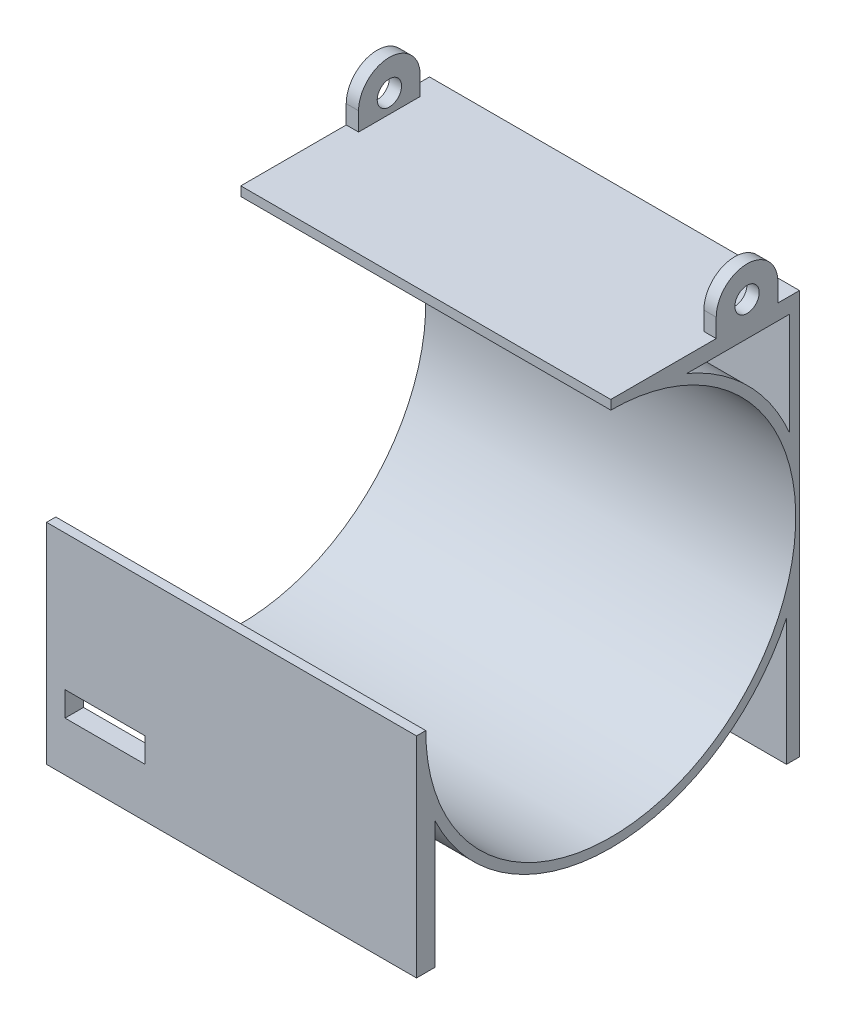
ISO-10303-21;
HEADER;
FILE_DESCRIPTION(('STEP AP214'),'2;1');
FILE_NAME('part.step','',(''),(''),'','','');
FILE_SCHEMA(('AUTOMOTIVE_DESIGN { 1 0 10303 214 1 1 1 1 }'));
ENDSEC;
DATA;
#1=APPLICATION_CONTEXT('core data for automotive mechanical design processes');
#2=APPLICATION_PROTOCOL_DEFINITION('international standard','automotive_design',2000,#1);
#3=PRODUCT_CONTEXT('',#1,'mechanical');
#4=PRODUCT('Part','Part','',(#3));
#5=PRODUCT_RELATED_PRODUCT_CATEGORY('part','',(#4));
#6=PRODUCT_DEFINITION_FORMATION('','',#4);
#7=PRODUCT_DEFINITION_CONTEXT('part definition',#1,'design');
#8=PRODUCT_DEFINITION('design','',#6,#7);
#9=PRODUCT_DEFINITION_SHAPE('','',#8);
#10=(LENGTH_UNIT() NAMED_UNIT(*) SI_UNIT(.MILLI.,.METRE.));
#11=(NAMED_UNIT(*) PLANE_ANGLE_UNIT() SI_UNIT($,.RADIAN.));
#12=(NAMED_UNIT(*) SI_UNIT($,.STERADIAN.) SOLID_ANGLE_UNIT());
#13=UNCERTAINTY_MEASURE_WITH_UNIT(LENGTH_MEASURE(1.E-05),#10,'distance_accuracy_value','');
#14=(GEOMETRIC_REPRESENTATION_CONTEXT(3) GLOBAL_UNCERTAINTY_ASSIGNED_CONTEXT((#13)) GLOBAL_UNIT_ASSIGNED_CONTEXT((#10,
#11,#12)) REPRESENTATION_CONTEXT('',''));
#15=CARTESIAN_POINT('',(0.,0.,0.));
#16=DIRECTION('',(0.,0.,1.));
#17=DIRECTION('',(1.,0.,0.));
#18=AXIS2_PLACEMENT_3D('',#15,#16,#17);
#19=CARTESIAN_POINT('',(-76.2,0.,0.));
#20=DIRECTION('',(1.,0.,0.));
#21=DIRECTION('',(0.,1.,0.));
#22=AXIS2_PLACEMENT_3D('',#19,#20,#21);
#23=PLANE('',#22);
#24=DIRECTION('',(0.,-1.,0.));
#25=VECTOR('',#24,1.);
#26=CARTESIAN_POINT('',(-76.2,80.01,-68.834));
#27=LINE('',#26,#25);
#28=CARTESIAN_POINT('',(-76.2,87.6300000000001,-68.834));
#29=VERTEX_POINT('',#28);
#30=CARTESIAN_POINT('',(-76.2,80.01,-68.834));
#31=VERTEX_POINT('',#30);
#32=EDGE_CURVE('E449',#29,#31,#27,.T.);
#33=ORIENTED_EDGE('',*,*,#32,.T.);
#34=DIRECTION('',(0.,0.,1.));
#35=VECTOR('',#34,1.);
#36=CARTESIAN_POINT('',(-76.2,80.01,80.01));
#37=LINE('',#36,#35);
#38=CARTESIAN_POINT('',(-76.2,80.01,-77.724));
#39=VERTEX_POINT('',#38);
#40=EDGE_CURVE('E336',#39,#31,#37,.T.);
#41=ORIENTED_EDGE('',*,*,#40,.F.);
#42=DIRECTION('',(0.,-1.,0.));
#43=VECTOR('',#42,1.);
#44=CARTESIAN_POINT('',(-76.2,0.,-77.724));
#45=LINE('',#44,#43);
#46=CARTESIAN_POINT('',(-76.2,-86.36,-77.724));
#47=VERTEX_POINT('',#46);
#48=EDGE_CURVE('E324',#39,#47,#45,.T.);
#49=ORIENTED_EDGE('',*,*,#48,.T.);
#50=DIRECTION('',(0.,0.,1.));
#51=VECTOR('',#50,1.);
#52=CARTESIAN_POINT('',(-76.2,-86.36,0.));
#53=LINE('',#52,#51);
#54=CARTESIAN_POINT('',(-76.2,-86.36,-72.39));
#55=VERTEX_POINT('',#54);
#56=EDGE_CURVE('E329',#47,#55,#53,.T.);
#57=ORIENTED_EDGE('',*,*,#56,.T.);
#58=DIRECTION('',(0.,1.,0.));
#59=VECTOR('',#58,1.);
#60=CARTESIAN_POINT('',(-76.2,-86.36,-72.39));
#61=LINE('',#60,#59);
#62=CARTESIAN_POINT('',(-76.2,-34.0776759770967,-72.39));
#63=VERTEX_POINT('',#62);
#64=EDGE_CURVE('E312',#55,#63,#61,.T.);
#65=ORIENTED_EDGE('',*,*,#64,.T.);
#66=CARTESIAN_POINT('',(-76.2,0.,0.));
#67=DIRECTION('',(1.,0.,0.));
#68=DIRECTION('',(0.,1.,0.));
#69=AXIS2_PLACEMENT_3D('',#66,#67,#68);
#70=CIRCLE('',#69,80.01);
#71=CARTESIAN_POINT('',(-76.2,-34.0776759770969,72.39));
#72=VERTEX_POINT('',#71);
#73=EDGE_CURVE('E311',#63,#72,#70,.F.);
#74=ORIENTED_EDGE('',*,*,#73,.T.);
#75=DIRECTION('',(0.,-1.,0.));
#76=VECTOR('',#75,1.);
#77=CARTESIAN_POINT('',(-76.2,-86.36,72.39));
#78=LINE('',#77,#76);
#79=CARTESIAN_POINT('',(-76.2,-86.36,72.39));
#80=VERTEX_POINT('',#79);
#81=EDGE_CURVE('E317',#72,#80,#78,.T.);
#82=ORIENTED_EDGE('',*,*,#81,.T.);
#83=CARTESIAN_POINT('',(-76.2,-86.36,80.01));
#84=VERTEX_POINT('',#83);
#85=EDGE_CURVE('E316',#80,#84,#53,.T.);
#86=ORIENTED_EDGE('',*,*,#85,.T.);
#87=DIRECTION('',(0.,-1.,0.));
#88=VECTOR('',#87,1.);
#89=CARTESIAN_POINT('',(-76.2,80.01,80.01));
#90=LINE('',#89,#88);
#91=CARTESIAN_POINT('',(-76.2,0.,80.01));
#92=VERTEX_POINT('',#91);
#93=EDGE_CURVE('E328',#92,#84,#90,.T.);
#94=ORIENTED_EDGE('',*,*,#93,.F.);
#95=DIRECTION('',(0.,0.,1.));
#96=VECTOR('',#95,1.);
#97=CARTESIAN_POINT('',(-76.2,0.,0.));
#98=LINE('',#97,#96);
#99=CARTESIAN_POINT('',(-76.2,0.,76.2));
#100=VERTEX_POINT('',#99);
#101=EDGE_CURVE('E358',#100,#92,#98,.T.);
#102=ORIENTED_EDGE('',*,*,#101,.F.);
#103=CARTESIAN_POINT('',(-76.2,0.,0.));
#104=DIRECTION('',(1.,0.,0.));
#105=DIRECTION('',(0.,1.,0.));
#106=AXIS2_PLACEMENT_3D('',#103,#104,#105);
#107=CIRCLE('',#106,76.2);
#108=CARTESIAN_POINT('',(-76.2,76.2,0.));
#109=VERTEX_POINT('',#108);
#110=EDGE_CURVE('E337',#109,#100,#107,.F.);
#111=ORIENTED_EDGE('',*,*,#110,.F.);
#112=DIRECTION('',(0.,-1.,0.));
#113=VECTOR('',#112,1.);
#114=CARTESIAN_POINT('',(-76.2,80.01,0.));
#115=LINE('',#114,#113);
#116=CARTESIAN_POINT('',(-76.2,80.01,0.));
#117=VERTEX_POINT('',#116);
#118=EDGE_CURVE('E355',#117,#109,#115,.T.);
#119=ORIENTED_EDGE('',*,*,#118,.F.);
#120=CARTESIAN_POINT('',(-76.2,80.01,-43.434));
#121=VERTEX_POINT('',#120);
#122=EDGE_CURVE('E341',#121,#117,#37,.T.);
#123=ORIENTED_EDGE('',*,*,#122,.F.);
#124=DIRECTION('',(0.,1.,0.));
#125=VECTOR('',#124,1.);
#126=CARTESIAN_POINT('',(-76.2,80.01,-43.434));
#127=LINE('',#126,#125);
#128=CARTESIAN_POINT('',(-76.2,87.6300000000001,-43.434));
#129=VERTEX_POINT('',#128);
#130=EDGE_CURVE('E457',#121,#129,#127,.T.);
#131=ORIENTED_EDGE('',*,*,#130,.T.);
#132=CARTESIAN_POINT('',(-76.2,87.6300000000001,-56.134));
#133=DIRECTION('',(1.,0.,0.));
#134=DIRECTION('',(0.,1.,0.));
#135=AXIS2_PLACEMENT_3D('',#132,#133,#134);
#136=CIRCLE('',#135,12.7);
#137=EDGE_CURVE('E453',#129,#29,#136,.F.);
#138=ORIENTED_EDGE('',*,*,#137,.T.);
#139=EDGE_LOOP('',(#33,#41,#49,#57,#65,#74,#82,#86,#94,#102,#111,#119,#123,#131,#138));
#140=FACE_BOUND('',#139,.T.);
#141=CARTESIAN_POINT('',(-76.2,87.6300000000001,-56.134));
#142=DIRECTION('',(1.,0.,0.));
#143=DIRECTION('',(0.,1.,0.));
#144=AXIS2_PLACEMENT_3D('',#141,#142,#143);
#145=CIRCLE('',#144,5.0165);
#146=CARTESIAN_POINT('',(-76.2,92.6465,-56.134));
#147=VERTEX_POINT('',#146);
#148=EDGE_CURVE('E279',#147,#147,#145,.F.);
#149=ORIENTED_EDGE('',*,*,#148,.F.);
#150=EDGE_LOOP('',(#149));
#151=FACE_BOUND('',#150,.T.);
#152=CARTESIAN_POINT('',(-76.2,0.,0.));
#153=DIRECTION('',(1.,0.,0.));
#154=DIRECTION('',(0.,1.,0.));
#155=AXIS2_PLACEMENT_3D('',#152,#153,#154);
#156=CIRCLE('',#155,80.01);
#157=CARTESIAN_POINT('',(-76.2,73.6092,-31.3573878912132));
#158=VERTEX_POINT('',#157);
#159=CARTESIAN_POINT('',(-76.2,31.3573878912132,-73.6092));
#160=VERTEX_POINT('',#159);
#161=EDGE_CURVE('E303',#158,#160,#156,.F.);
#162=ORIENTED_EDGE('',*,*,#161,.T.);
#163=DIRECTION('',(0.,1.,0.));
#164=VECTOR('',#163,1.);
#165=CARTESIAN_POINT('',(-76.2,0.,-73.6092));
#166=LINE('',#165,#164);
#167=CARTESIAN_POINT('',(-76.2,73.6092,-73.6092));
#168=VERTEX_POINT('',#167);
#169=EDGE_CURVE('E299',#160,#168,#166,.T.);
#170=ORIENTED_EDGE('',*,*,#169,.T.);
#171=DIRECTION('',(0.,0.,1.));
#172=VECTOR('',#171,1.);
#173=CARTESIAN_POINT('',(-76.2,73.6092,0.));
#174=LINE('',#173,#172);
#175=EDGE_CURVE('E307',#168,#158,#174,.T.);
#176=ORIENTED_EDGE('',*,*,#175,.T.);
#177=EDGE_LOOP('',(#162,#170,#176));
#178=FACE_BOUND('',#177,.T.);
#179=ADVANCED_FACE('F44',(#140,#151,#178),#23,.F.);
#180=CARTESIAN_POINT('',(76.2,0.,0.));
#181=DIRECTION('',(-1.,0.,0.));
#182=DIRECTION('',(0.,-1.,0.));
#183=AXIS2_PLACEMENT_3D('',#180,#181,#182);
#184=PLANE('',#183);
#185=CARTESIAN_POINT('',(76.2,87.6300000000001,-56.134));
#186=DIRECTION('',(-1.,0.,0.));
#187=DIRECTION('',(0.,-1.,0.));
#188=AXIS2_PLACEMENT_3D('',#185,#186,#187);
#189=CIRCLE('',#188,5.0165);
#190=CARTESIAN_POINT('',(76.2,82.6135000000001,-56.134));
#191=VERTEX_POINT('',#190);
#192=EDGE_CURVE('E452',#191,#191,#189,.T.);
#193=ORIENTED_EDGE('',*,*,#192,.T.);
#194=EDGE_LOOP('',(#193));
#195=FACE_BOUND('',#194,.T.);
#196=CARTESIAN_POINT('',(76.2,0.,0.));
#197=DIRECTION('',(-1.,0.,0.));
#198=DIRECTION('',(0.,-1.,0.));
#199=AXIS2_PLACEMENT_3D('',#196,#197,#198);
#200=CIRCLE('',#199,80.01);
#201=CARTESIAN_POINT('',(76.2,73.6092,-31.3573878912132));
#202=VERTEX_POINT('',#201);
#203=CARTESIAN_POINT('',(76.2,31.3573878912132,-73.6092));
#204=VERTEX_POINT('',#203);
#205=EDGE_CURVE('E292',#202,#204,#200,.T.);
#206=ORIENTED_EDGE('',*,*,#205,.F.);
#207=DIRECTION('',(0.,0.,1.));
#208=VECTOR('',#207,1.);
#209=CARTESIAN_POINT('',(76.2,73.6092,-31.3573878912132));
#210=LINE('',#209,#208);
#211=CARTESIAN_POINT('',(76.2,73.6092,-73.6092));
#212=VERTEX_POINT('',#211);
#213=EDGE_CURVE('E296',#212,#202,#210,.T.);
#214=ORIENTED_EDGE('',*,*,#213,.F.);
#215=DIRECTION('',(0.,1.,0.));
#216=VECTOR('',#215,1.);
#217=CARTESIAN_POINT('',(76.2,73.6092,-73.6092));
#218=LINE('',#217,#216);
#219=EDGE_CURVE('E289',#204,#212,#218,.T.);
#220=ORIENTED_EDGE('',*,*,#219,.F.);
#221=EDGE_LOOP('',(#206,#214,#220));
#222=FACE_BOUND('',#221,.T.);
#223=DIRECTION('',(0.,0.,-1.));
#224=VECTOR('',#223,1.);
#225=CARTESIAN_POINT('',(76.2,-86.36,0.));
#226=LINE('',#225,#224);
#227=CARTESIAN_POINT('',(76.2,-86.36,80.01));
#228=VERTEX_POINT('',#227);
#229=CARTESIAN_POINT('',(76.2,-86.36,72.39));
#230=VERTEX_POINT('',#229);
#231=EDGE_CURVE('E487',#228,#230,#226,.T.);
#232=ORIENTED_EDGE('',*,*,#231,.T.);
#233=DIRECTION('',(0.,1.,0.));
#234=VECTOR('',#233,1.);
#235=CARTESIAN_POINT('',(76.2,-86.36,72.39));
#236=LINE('',#235,#234);
#237=CARTESIAN_POINT('',(76.2,-34.0776759770969,72.39));
#238=VERTEX_POINT('',#237);
#239=EDGE_CURVE('E492',#230,#238,#236,.T.);
#240=ORIENTED_EDGE('',*,*,#239,.T.);
#241=CARTESIAN_POINT('',(76.2,0.,0.));
#242=DIRECTION('',(-1.,0.,0.));
#243=DIRECTION('',(0.,-1.,0.));
#244=AXIS2_PLACEMENT_3D('',#241,#242,#243);
#245=CIRCLE('',#244,80.01);
#246=CARTESIAN_POINT('',(76.2,-34.0776759770967,-72.39));
#247=VERTEX_POINT('',#246);
#248=EDGE_CURVE('E500',#238,#247,#245,.F.);
#249=ORIENTED_EDGE('',*,*,#248,.T.);
#250=DIRECTION('',(0.,-1.,0.));
#251=VECTOR('',#250,1.);
#252=CARTESIAN_POINT('',(76.2,-86.36,-72.39));
#253=LINE('',#252,#251);
#254=CARTESIAN_POINT('',(76.2,-86.36,-72.39));
#255=VERTEX_POINT('',#254);
#256=EDGE_CURVE('E496',#247,#255,#253,.T.);
#257=ORIENTED_EDGE('',*,*,#256,.T.);
#258=CARTESIAN_POINT('',(76.2,-86.36,-77.724));
#259=VERTEX_POINT('',#258);
#260=EDGE_CURVE('E488',#255,#259,#226,.T.);
#261=ORIENTED_EDGE('',*,*,#260,.T.);
#262=DIRECTION('',(0.,1.,0.));
#263=VECTOR('',#262,1.);
#264=CARTESIAN_POINT('',(76.2,0.,-77.724));
#265=LINE('',#264,#263);
#266=CARTESIAN_POINT('',(76.2,80.01,-77.724));
#267=VERTEX_POINT('',#266);
#268=EDGE_CURVE('E286',#259,#267,#265,.T.);
#269=ORIENTED_EDGE('',*,*,#268,.T.);
#270=DIRECTION('',(0.,0.,-1.));
#271=VECTOR('',#270,1.);
#272=CARTESIAN_POINT('',(76.2,80.01,80.01));
#273=LINE('',#272,#271);
#274=CARTESIAN_POINT('',(76.2,80.01,-68.834));
#275=VERTEX_POINT('',#274);
#276=EDGE_CURVE('E285',#275,#267,#273,.T.);
#277=ORIENTED_EDGE('',*,*,#276,.F.);
#278=DIRECTION('',(0.,-1.,0.));
#279=VECTOR('',#278,1.);
#280=CARTESIAN_POINT('',(76.2,80.01,-68.834));
#281=LINE('',#280,#279);
#282=CARTESIAN_POINT('',(76.2,87.6300000000001,-68.834));
#283=VERTEX_POINT('',#282);
#284=EDGE_CURVE('E271',#283,#275,#281,.T.);
#285=ORIENTED_EDGE('',*,*,#284,.F.);
#286=CARTESIAN_POINT('',(76.2,87.6300000000001,-56.134));
#287=DIRECTION('',(-1.,0.,0.));
#288=DIRECTION('',(0.,-1.,0.));
#289=AXIS2_PLACEMENT_3D('',#286,#287,#288);
#290=CIRCLE('',#289,12.7);
#291=CARTESIAN_POINT('',(76.2,87.6300000000001,-43.434));
#292=VERTEX_POINT('',#291);
#293=EDGE_CURVE('E276',#292,#283,#290,.T.);
#294=ORIENTED_EDGE('',*,*,#293,.F.);
#295=DIRECTION('',(0.,1.,0.));
#296=VECTOR('',#295,1.);
#297=CARTESIAN_POINT('',(76.2,80.01,-43.434));
#298=LINE('',#297,#296);
#299=CARTESIAN_POINT('',(76.2,80.01,-43.434));
#300=VERTEX_POINT('',#299);
#301=EDGE_CURVE('E275',#300,#292,#298,.T.);
#302=ORIENTED_EDGE('',*,*,#301,.F.);
#303=CARTESIAN_POINT('',(76.2,80.01,0.));
#304=VERTEX_POINT('',#303);
#305=EDGE_CURVE('E282',#304,#300,#273,.T.);
#306=ORIENTED_EDGE('',*,*,#305,.F.);
#307=DIRECTION('',(0.,1.,0.));
#308=VECTOR('',#307,1.);
#309=CARTESIAN_POINT('',(76.2,0.,0.));
#310=LINE('',#309,#308);
#311=CARTESIAN_POINT('',(76.2,76.2,0.));
#312=VERTEX_POINT('',#311);
#313=EDGE_CURVE('E348',#312,#304,#310,.T.);
#314=ORIENTED_EDGE('',*,*,#313,.F.);
#315=CARTESIAN_POINT('',(76.2,0.,0.));
#316=DIRECTION('',(-1.,0.,0.));
#317=DIRECTION('',(0.,-1.,0.));
#318=AXIS2_PLACEMENT_3D('',#315,#316,#317);
#319=CIRCLE('',#318,76.2);
#320=CARTESIAN_POINT('',(76.2,0.,76.2));
#321=VERTEX_POINT('',#320);
#322=EDGE_CURVE('E272',#321,#312,#319,.F.);
#323=ORIENTED_EDGE('',*,*,#322,.F.);
#324=DIRECTION('',(0.,0.,1.));
#325=VECTOR('',#324,1.);
#326=CARTESIAN_POINT('',(76.2,0.,0.));
#327=LINE('',#326,#325);
#328=CARTESIAN_POINT('',(76.2,0.,80.01));
#329=VERTEX_POINT('',#328);
#330=EDGE_CURVE('E48',#321,#329,#327,.T.);
#331=ORIENTED_EDGE('',*,*,#330,.T.);
#332=DIRECTION('',(0.,1.,0.));
#333=VECTOR('',#332,1.);
#334=CARTESIAN_POINT('',(76.2,80.01,80.01));
#335=LINE('',#334,#333);
#336=EDGE_CURVE('E268',#228,#329,#335,.T.);
#337=ORIENTED_EDGE('',*,*,#336,.F.);
#338=EDGE_LOOP('',(#232,#240,#249,#257,#261,#269,#277,#285,#294,#302,#306,#314,#323,#331,#337));
#339=FACE_BOUND('',#338,.T.);
#340=ADVANCED_FACE('F507',(#195,#222,#339),#184,.F.);
#341=CARTESIAN_POINT('',(-177.8,0.,0.));
#342=DIRECTION('',(1.,0.,0.));
#343=DIRECTION('',(0.,0.,-1.));
#344=AXIS2_PLACEMENT_3D('',#341,#342,#343);
#345=CYLINDRICAL_SURFACE('',#344,80.01);
#346=DIRECTION('',(1.,0.,0.));
#347=VECTOR('',#346,1.);
#348=CARTESIAN_POINT('',(-177.8,73.6092,-31.3573878912132));
#349=LINE('',#348,#347);
#350=EDGE_CURVE('E54',#158,#202,#349,.T.);
#351=ORIENTED_EDGE('',*,*,#350,.T.);
#352=ORIENTED_EDGE('',*,*,#205,.T.);
#353=DIRECTION('',(1.,0.,0.));
#354=VECTOR('',#353,1.);
#355=CARTESIAN_POINT('',(-177.8,31.3573878912132,-73.6092));
#356=LINE('',#355,#354);
#357=EDGE_CURVE('E438',#160,#204,#356,.T.);
#358=ORIENTED_EDGE('',*,*,#357,.F.);
#359=ORIENTED_EDGE('',*,*,#161,.F.);
#360=EDGE_LOOP('',(#351,#352,#358,#359));
#361=FACE_BOUND('',#360,.T.);
#362=ADVANCED_FACE('F535',(#361),#345,.T.);
#363=CARTESIAN_POINT('',(-177.8,73.6092,-73.6092));
#364=DIRECTION('',(0.,0.,-1.));
#365=DIRECTION('',(-1.,0.,0.));
#366=AXIS2_PLACEMENT_3D('',#363,#364,#365);
#367=PLANE('',#366);
#368=ORIENTED_EDGE('',*,*,#357,.T.);
#369=ORIENTED_EDGE('',*,*,#219,.T.);
#370=DIRECTION('',(1.,0.,0.));
#371=VECTOR('',#370,1.);
#372=CARTESIAN_POINT('',(-177.8,73.6092,-73.6092));
#373=LINE('',#372,#371);
#374=EDGE_CURVE('E11',#168,#212,#373,.T.);
#375=ORIENTED_EDGE('',*,*,#374,.F.);
#376=ORIENTED_EDGE('',*,*,#169,.F.);
#377=EDGE_LOOP('',(#368,#369,#375,#376));
#378=FACE_BOUND('',#377,.T.);
#379=ADVANCED_FACE('F780',(#378),#367,.F.);
#380=CARTESIAN_POINT('',(-177.8,73.6092,-31.3573878912132));
#381=DIRECTION('',(0.,1.,0.));
#382=DIRECTION('',(0.,0.,1.));
#383=AXIS2_PLACEMENT_3D('',#380,#381,#382);
#384=PLANE('',#383);
#385=ORIENTED_EDGE('',*,*,#374,.T.);
#386=ORIENTED_EDGE('',*,*,#213,.T.);
#387=ORIENTED_EDGE('',*,*,#350,.F.);
#388=ORIENTED_EDGE('',*,*,#175,.F.);
#389=EDGE_LOOP('',(#385,#386,#387,#388));
#390=FACE_BOUND('',#389,.T.);
#391=ADVANCED_FACE('F537',(#390),#384,.F.);
#392=CARTESIAN_POINT('',(-71.12,80.01,-68.834));
#393=DIRECTION('',(0.,0.,-1.));
#394=DIRECTION('',(-1.,0.,0.));
#395=AXIS2_PLACEMENT_3D('',#392,#393,#394);
#396=PLANE('',#395);
#397=ORIENTED_EDGE('',*,*,#32,.F.);
#398=DIRECTION('',(-1.,0.,0.));
#399=VECTOR('',#398,1.);
#400=CARTESIAN_POINT('',(-71.12,87.6300000000001,-68.834));
#401=LINE('',#400,#399);
#402=CARTESIAN_POINT('',(-71.12,87.6300000000001,-68.834));
#403=VERTEX_POINT('',#402);
#404=EDGE_CURVE('E418',#403,#29,#401,.T.);
#405=ORIENTED_EDGE('',*,*,#404,.F.);
#406=DIRECTION('',(0.,-1.,0.));
#407=VECTOR('',#406,1.);
#408=CARTESIAN_POINT('',(-71.12,80.01,-68.834));
#409=LINE('',#408,#407);
#410=CARTESIAN_POINT('',(-71.12,80.01,-68.834));
#411=VERTEX_POINT('',#410);
#412=EDGE_CURVE('E431',#403,#411,#409,.T.);
#413=ORIENTED_EDGE('',*,*,#412,.T.);
#414=DIRECTION('',(-1.,0.,0.));
#415=VECTOR('',#414,1.);
#416=CARTESIAN_POINT('',(-71.12,80.01,-68.834));
#417=LINE('',#416,#415);
#418=EDGE_CURVE('E423',#411,#31,#417,.T.);
#419=ORIENTED_EDGE('',*,*,#418,.T.);
#420=EDGE_LOOP('',(#397,#405,#413,#419));
#421=FACE_BOUND('',#420,.T.);
#422=ADVANCED_FACE('F542',(#421),#396,.T.);
#423=CARTESIAN_POINT('',(-71.12,87.6300000000001,-56.134));
#424=DIRECTION('',(-1.,0.,0.));
#425=DIRECTION('',(0.,-1.,0.));
#426=AXIS2_PLACEMENT_3D('',#423,#424,#425);
#427=CYLINDRICAL_SURFACE('',#426,12.7);
#428=ORIENTED_EDGE('',*,*,#137,.F.);
#429=DIRECTION('',(-1.,0.,0.));
#430=VECTOR('',#429,1.);
#431=CARTESIAN_POINT('',(-71.12,87.6300000000001,-43.434));
#432=LINE('',#431,#430);
#433=CARTESIAN_POINT('',(-71.12,87.6300000000001,-43.434));
#434=VERTEX_POINT('',#433);
#435=EDGE_CURVE('E467',#434,#129,#432,.T.);
#436=ORIENTED_EDGE('',*,*,#435,.F.);
#437=CARTESIAN_POINT('',(-71.12,87.6300000000001,-56.134));
#438=DIRECTION('',(-1.,0.,0.));
#439=DIRECTION('',(0.,1.,0.));
#440=AXIS2_PLACEMENT_3D('',#437,#438,#439);
#441=CIRCLE('',#440,12.7);
#442=EDGE_CURVE('E427',#434,#403,#441,.T.);
#443=ORIENTED_EDGE('',*,*,#442,.T.);
#444=ORIENTED_EDGE('',*,*,#404,.T.);
#445=EDGE_LOOP('',(#428,#436,#443,#444));
#446=FACE_BOUND('',#445,.T.);
#447=ADVANCED_FACE('F545',(#446),#427,.T.);
#448=CARTESIAN_POINT('',(-71.12,87.6300000000001,-56.134));
#449=DIRECTION('',(-1.,0.,0.));
#450=DIRECTION('',(0.,1.,0.));
#451=AXIS2_PLACEMENT_3D('',#448,#449,#450);
#452=PLANE('',#451);
#453=CARTESIAN_POINT('',(-71.12,87.6300000000001,-56.134));
#454=DIRECTION('',(-1.,0.,0.));
#455=DIRECTION('',(0.,-1.,0.));
#456=AXIS2_PLACEMENT_3D('',#453,#454,#455);
#457=CIRCLE('',#456,5.0165);
#458=CARTESIAN_POINT('',(-71.12,82.6135000000001,-56.134));
#459=VERTEX_POINT('',#458);
#460=EDGE_CURVE('E435',#459,#459,#457,.T.);
#461=ORIENTED_EDGE('',*,*,#460,.T.);
#462=EDGE_LOOP('',(#461));
#463=FACE_BOUND('',#462,.T.);
#464=ORIENTED_EDGE('',*,*,#412,.F.);
#465=ORIENTED_EDGE('',*,*,#442,.F.);
#466=DIRECTION('',(0.,1.,0.));
#467=VECTOR('',#466,1.);
#468=CARTESIAN_POINT('',(-71.12,80.01,-43.434));
#469=LINE('',#468,#467);
#470=CARTESIAN_POINT('',(-71.12,80.01,-43.434));
#471=VERTEX_POINT('',#470);
#472=EDGE_CURVE('E422',#471,#434,#469,.T.);
#473=ORIENTED_EDGE('',*,*,#472,.F.);
#474=DIRECTION('',(0.,0.,1.));
#475=VECTOR('',#474,1.);
#476=CARTESIAN_POINT('',(-71.12,80.01,-68.834));
#477=LINE('',#476,#475);
#478=EDGE_CURVE('E419',#411,#471,#477,.T.);
#479=ORIENTED_EDGE('',*,*,#478,.F.);
#480=EDGE_LOOP('',(#464,#465,#473,#479));
#481=FACE_BOUND('',#480,.T.);
#482=ADVANCED_FACE('F551',(#463,#481),#452,.F.);
#483=CARTESIAN_POINT('',(-71.12,87.6300000000001,-56.134));
#484=DIRECTION('',(-1.,0.,0.));
#485=DIRECTION('',(0.,-1.,0.));
#486=AXIS2_PLACEMENT_3D('',#483,#484,#485);
#487=CYLINDRICAL_SURFACE('',#486,5.0165);
#488=ORIENTED_EDGE('',*,*,#148,.T.);
#489=EDGE_LOOP('',(#488));
#490=FACE_BOUND('',#489,.T.);
#491=ORIENTED_EDGE('',*,*,#460,.F.);
#492=EDGE_LOOP('',(#491));
#493=FACE_BOUND('',#492,.T.);
#494=ADVANCED_FACE('F548',(#490,#493),#487,.F.);
#495=CARTESIAN_POINT('',(203.2,80.01,80.01));
#496=DIRECTION('',(0.,-1.,0.));
#497=DIRECTION('',(0.,0.,-1.));
#498=AXIS2_PLACEMENT_3D('',#495,#496,#497);
#499=PLANE('',#498);
#500=DIRECTION('',(-1.,0.,0.));
#501=VECTOR('',#500,1.);
#502=CARTESIAN_POINT('',(76.2,80.01,0.));
#503=LINE('',#502,#501);
#504=EDGE_CURVE('E351',#304,#117,#503,.T.);
#505=ORIENTED_EDGE('',*,*,#504,.F.);
#506=ORIENTED_EDGE('',*,*,#305,.T.);
#507=DIRECTION('',(1.,0.,0.));
#508=VECTOR('',#507,1.);
#509=CARTESIAN_POINT('',(71.12,80.01,-43.434));
#510=LINE('',#509,#508);
#511=CARTESIAN_POINT('',(71.12,80.01,-43.434));
#512=VERTEX_POINT('',#511);
#513=EDGE_CURVE('E389',#512,#300,#510,.T.);
#514=ORIENTED_EDGE('',*,*,#513,.F.);
#515=DIRECTION('',(0.,0.,1.));
#516=VECTOR('',#515,1.);
#517=CARTESIAN_POINT('',(71.12,80.01,-68.834));
#518=LINE('',#517,#516);
#519=CARTESIAN_POINT('',(71.12,80.01,-68.834));
#520=VERTEX_POINT('',#519);
#521=EDGE_CURVE('E407',#520,#512,#518,.T.);
#522=ORIENTED_EDGE('',*,*,#521,.F.);
#523=DIRECTION('',(1.,0.,0.));
#524=VECTOR('',#523,1.);
#525=CARTESIAN_POINT('',(71.12,80.01,-68.834));
#526=LINE('',#525,#524);
#527=EDGE_CURVE('E385',#520,#275,#526,.T.);
#528=ORIENTED_EDGE('',*,*,#527,.T.);
#529=ORIENTED_EDGE('',*,*,#276,.T.);
#530=DIRECTION('',(1.,0.,0.));
#531=VECTOR('',#530,1.);
#532=CARTESIAN_POINT('',(203.2,80.01,-77.724));
#533=LINE('',#532,#531);
#534=EDGE_CURVE('E342',#39,#267,#533,.T.);
#535=ORIENTED_EDGE('',*,*,#534,.F.);
#536=ORIENTED_EDGE('',*,*,#40,.T.);
#537=ORIENTED_EDGE('',*,*,#418,.F.);
#538=ORIENTED_EDGE('',*,*,#478,.T.);
#539=DIRECTION('',(-1.,0.,0.));
#540=VECTOR('',#539,1.);
#541=CARTESIAN_POINT('',(-71.12,80.01,-43.434));
#542=LINE('',#541,#540);
#543=EDGE_CURVE('E471',#471,#121,#542,.T.);
#544=ORIENTED_EDGE('',*,*,#543,.T.);
#545=ORIENTED_EDGE('',*,*,#122,.T.);
#546=EDGE_LOOP('',(#505,#506,#514,#522,#528,#529,#535,#536,#537,#538,#544,#545));
#547=FACE_BOUND('',#546,.T.);
#548=ADVANCED_FACE('F550',(#547),#499,.F.);
#549=CARTESIAN_POINT('',(-71.12,80.01,-43.434));
#550=DIRECTION('',(0.,0.,1.));
#551=DIRECTION('',(1.,0.,0.));
#552=AXIS2_PLACEMENT_3D('',#549,#550,#551);
#553=PLANE('',#552);
#554=ORIENTED_EDGE('',*,*,#130,.F.);
#555=ORIENTED_EDGE('',*,*,#543,.F.);
#556=ORIENTED_EDGE('',*,*,#472,.T.);
#557=ORIENTED_EDGE('',*,*,#435,.T.);
#558=EDGE_LOOP('',(#554,#555,#556,#557));
#559=FACE_BOUND('',#558,.T.);
#560=ADVANCED_FACE('F46',(#559),#553,.T.);
#561=CARTESIAN_POINT('',(-203.2,0.,0.));
#562=DIRECTION('',(1.,0.,0.));
#563=DIRECTION('',(0.,0.,-1.));
#564=AXIS2_PLACEMENT_3D('',#561,#562,#563);
#565=CYLINDRICAL_SURFACE('',#564,76.2);
#566=DIRECTION('',(1.,0.,0.));
#567=VECTOR('',#566,1.);
#568=CARTESIAN_POINT('',(-203.2,0.,76.2));
#569=LINE('',#568,#567);
#570=EDGE_CURVE('E347',#100,#321,#569,.T.);
#571=ORIENTED_EDGE('',*,*,#570,.T.);
#572=ORIENTED_EDGE('',*,*,#322,.T.);
#573=DIRECTION('',(1.,0.,0.));
#574=VECTOR('',#573,1.);
#575=CARTESIAN_POINT('',(-203.2,76.2,0.));
#576=LINE('',#575,#574);
#577=EDGE_CURVE('E364',#109,#312,#576,.T.);
#578=ORIENTED_EDGE('',*,*,#577,.F.);
#579=ORIENTED_EDGE('',*,*,#110,.T.);
#580=EDGE_LOOP('',(#571,#572,#578,#579));
#581=FACE_BOUND('',#580,.T.);
#582=ADVANCED_FACE('F608',(#581),#565,.F.);
#583=CARTESIAN_POINT('',(0.,0.,0.));
#584=DIRECTION('',(0.,0.,1.));
#585=DIRECTION('',(1.,0.,0.));
#586=AXIS2_PLACEMENT_3D('',#583,#584,#585);
#587=PLANE('',#586);
#588=ORIENTED_EDGE('',*,*,#577,.T.);
#589=ORIENTED_EDGE('',*,*,#313,.T.);
#590=ORIENTED_EDGE('',*,*,#504,.T.);
#591=ORIENTED_EDGE('',*,*,#118,.T.);
#592=EDGE_LOOP('',(#588,#589,#590,#591));
#593=FACE_BOUND('',#592,.T.);
#594=ADVANCED_FACE('F612',(#593),#587,.T.);
#595=CARTESIAN_POINT('',(203.2,80.01,80.01));
#596=DIRECTION('',(0.,0.,-1.));
#597=DIRECTION('',(-1.,0.,0.));
#598=AXIS2_PLACEMENT_3D('',#595,#596,#597);
#599=PLANE('',#598);
#600=DIRECTION('',(0.,1.,0.));
#601=VECTOR('',#600,1.);
#602=CARTESIAN_POINT('',(-35.56,-55.88,80.01));
#603=LINE('',#602,#601);
#604=CARTESIAN_POINT('',(-35.56,-66.04,80.01));
#605=VERTEX_POINT('',#604);
#606=CARTESIAN_POINT('',(-35.56,-55.88,80.01));
#607=VERTEX_POINT('',#606);
#608=EDGE_CURVE('E236',#605,#607,#603,.T.);
#609=ORIENTED_EDGE('',*,*,#608,.F.);
#610=DIRECTION('',(1.,0.,0.));
#611=VECTOR('',#610,1.);
#612=CARTESIAN_POINT('',(-68.58,-66.04,80.01));
#613=LINE('',#612,#611);
#614=CARTESIAN_POINT('',(-68.58,-66.04,80.01));
#615=VERTEX_POINT('',#614);
#616=EDGE_CURVE('E252',#615,#605,#613,.T.);
#617=ORIENTED_EDGE('',*,*,#616,.F.);
#618=DIRECTION('',(0.,-1.,0.));
#619=VECTOR('',#618,1.);
#620=CARTESIAN_POINT('',(-68.58,-55.88,80.01));
#621=LINE('',#620,#619);
#622=CARTESIAN_POINT('',(-68.58,-55.88,80.01));
#623=VERTEX_POINT('',#622);
#624=EDGE_CURVE('E249',#623,#615,#621,.T.);
#625=ORIENTED_EDGE('',*,*,#624,.F.);
#626=DIRECTION('',(-1.,0.,0.));
#627=VECTOR('',#626,1.);
#628=CARTESIAN_POINT('',(-68.58,-55.88,80.01));
#629=LINE('',#628,#627);
#630=EDGE_CURVE('E62',#607,#623,#629,.T.);
#631=ORIENTED_EDGE('',*,*,#630,.F.);
#632=EDGE_LOOP('',(#609,#617,#625,#631));
#633=FACE_BOUND('',#632,.T.);
#634=DIRECTION('',(-1.,0.,0.));
#635=VECTOR('',#634,1.);
#636=CARTESIAN_POINT('',(203.2,-86.36,80.01));
#637=LINE('',#636,#635);
#638=EDGE_CURVE('E374',#228,#84,#637,.T.);
#639=ORIENTED_EDGE('',*,*,#638,.F.);
#640=ORIENTED_EDGE('',*,*,#336,.T.);
#641=DIRECTION('',(1.,0.,0.));
#642=VECTOR('',#641,1.);
#643=CARTESIAN_POINT('',(-76.2,0.,80.01));
#644=LINE('',#643,#642);
#645=EDGE_CURVE('E340',#92,#329,#644,.T.);
#646=ORIENTED_EDGE('',*,*,#645,.F.);
#647=ORIENTED_EDGE('',*,*,#93,.T.);
#648=EDGE_LOOP('',(#639,#640,#646,#647));
#649=FACE_BOUND('',#648,.T.);
#650=ADVANCED_FACE('F525',(#633,#649),#599,.F.);
#651=CARTESIAN_POINT('',(-76.2,0.,0.));
#652=DIRECTION('',(0.,-1.,0.));
#653=DIRECTION('',(1.,0.,0.));
#654=AXIS2_PLACEMENT_3D('',#651,#652,#653);
#655=PLANE('',#654);
#656=ORIENTED_EDGE('',*,*,#101,.T.);
#657=ORIENTED_EDGE('',*,*,#645,.T.);
#658=ORIENTED_EDGE('',*,*,#330,.F.);
#659=ORIENTED_EDGE('',*,*,#570,.F.);
#660=EDGE_LOOP('',(#656,#657,#658,#659));
#661=FACE_BOUND('',#660,.T.);
#662=ADVANCED_FACE('F519',(#661),#655,.F.);
#663=CARTESIAN_POINT('',(71.12,87.6300000000001,-56.134));
#664=DIRECTION('',(1.,0.,0.));
#665=DIRECTION('',(0.,1.,0.));
#666=AXIS2_PLACEMENT_3D('',#663,#664,#665);
#667=PLANE('',#666);
#668=DIRECTION('',(0.,-1.,0.));
#669=VECTOR('',#668,1.);
#670=CARTESIAN_POINT('',(71.12,80.01,-68.834));
#671=LINE('',#670,#669);
#672=CARTESIAN_POINT('',(71.12,87.6300000000001,-68.834));
#673=VERTEX_POINT('',#672);
#674=EDGE_CURVE('E410',#673,#520,#671,.T.);
#675=ORIENTED_EDGE('',*,*,#674,.T.);
#676=ORIENTED_EDGE('',*,*,#521,.T.);
#677=DIRECTION('',(0.,1.,0.));
#678=VECTOR('',#677,1.);
#679=CARTESIAN_POINT('',(71.12,80.01,-43.434));
#680=LINE('',#679,#678);
#681=CARTESIAN_POINT('',(71.12,87.6300000000001,-43.434));
#682=VERTEX_POINT('',#681);
#683=EDGE_CURVE('E404',#512,#682,#680,.T.);
#684=ORIENTED_EDGE('',*,*,#683,.T.);
#685=CARTESIAN_POINT('',(71.12,87.6300000000001,-56.134));
#686=DIRECTION('',(-1.,0.,0.));
#687=DIRECTION('',(0.,1.,0.));
#688=AXIS2_PLACEMENT_3D('',#685,#686,#687);
#689=CIRCLE('',#688,12.7);
#690=EDGE_CURVE('E401',#682,#673,#689,.T.);
#691=ORIENTED_EDGE('',*,*,#690,.T.);
#692=EDGE_LOOP('',(#675,#676,#684,#691));
#693=FACE_BOUND('',#692,.T.);
#694=CARTESIAN_POINT('',(71.12,87.6300000000001,-56.134));
#695=DIRECTION('',(-1.,0.,0.));
#696=DIRECTION('',(0.,-1.,0.));
#697=AXIS2_PLACEMENT_3D('',#694,#695,#696);
#698=CIRCLE('',#697,5.0165);
#699=CARTESIAN_POINT('',(71.12,82.6135000000001,-56.134));
#700=VERTEX_POINT('',#699);
#701=EDGE_CURVE('E414',#700,#700,#698,.T.);
#702=ORIENTED_EDGE('',*,*,#701,.F.);
#703=EDGE_LOOP('',(#702));
#704=FACE_BOUND('',#703,.T.);
#705=ADVANCED_FACE('F514',(#693,#704),#667,.F.);
#706=CARTESIAN_POINT('',(71.12,87.6300000000001,-56.134));
#707=DIRECTION('',(1.,0.,0.));
#708=DIRECTION('',(0.,1.,0.));
#709=AXIS2_PLACEMENT_3D('',#706,#707,#708);
#710=CYLINDRICAL_SURFACE('',#709,5.0165);
#711=ORIENTED_EDGE('',*,*,#192,.F.);
#712=EDGE_LOOP('',(#711));
#713=FACE_BOUND('',#712,.T.);
#714=ORIENTED_EDGE('',*,*,#701,.T.);
#715=EDGE_LOOP('',(#714));
#716=FACE_BOUND('',#715,.T.);
#717=ADVANCED_FACE('F510',(#713,#716),#710,.F.);
#718=CARTESIAN_POINT('',(71.12,80.01,-68.834));
#719=DIRECTION('',(0.,0.,1.));
#720=DIRECTION('',(1.,0.,0.));
#721=AXIS2_PLACEMENT_3D('',#718,#719,#720);
#722=PLANE('',#721);
#723=DIRECTION('',(1.,0.,0.));
#724=VECTOR('',#723,1.);
#725=CARTESIAN_POINT('',(71.12,87.6300000000001,-68.834));
#726=LINE('',#725,#724);
#727=EDGE_CURVE('E397',#673,#283,#726,.T.);
#728=ORIENTED_EDGE('',*,*,#727,.T.);
#729=ORIENTED_EDGE('',*,*,#284,.T.);
#730=ORIENTED_EDGE('',*,*,#527,.F.);
#731=ORIENTED_EDGE('',*,*,#674,.F.);
#732=EDGE_LOOP('',(#728,#729,#730,#731));
#733=FACE_BOUND('',#732,.T.);
#734=ADVANCED_FACE('F513',(#733),#722,.F.);
#735=CARTESIAN_POINT('',(71.12,80.01,-43.434));
#736=DIRECTION('',(0.,0.,-1.));
#737=DIRECTION('',(-1.,0.,0.));
#738=AXIS2_PLACEMENT_3D('',#735,#736,#737);
#739=PLANE('',#738);
#740=ORIENTED_EDGE('',*,*,#513,.T.);
#741=ORIENTED_EDGE('',*,*,#301,.T.);
#742=DIRECTION('',(1.,0.,0.));
#743=VECTOR('',#742,1.);
#744=CARTESIAN_POINT('',(71.12,87.6300000000001,-43.434));
#745=LINE('',#744,#743);
#746=EDGE_CURVE('E393',#682,#292,#745,.T.);
#747=ORIENTED_EDGE('',*,*,#746,.F.);
#748=ORIENTED_EDGE('',*,*,#683,.F.);
#749=EDGE_LOOP('',(#740,#741,#747,#748));
#750=FACE_BOUND('',#749,.T.);
#751=ADVANCED_FACE('F623',(#750),#739,.F.);
#752=CARTESIAN_POINT('',(71.12,87.6300000000001,-56.134));
#753=DIRECTION('',(1.,0.,0.));
#754=DIRECTION('',(0.,1.,0.));
#755=AXIS2_PLACEMENT_3D('',#752,#753,#754);
#756=CYLINDRICAL_SURFACE('',#755,12.7);
#757=ORIENTED_EDGE('',*,*,#746,.T.);
#758=ORIENTED_EDGE('',*,*,#293,.T.);
#759=ORIENTED_EDGE('',*,*,#727,.F.);
#760=ORIENTED_EDGE('',*,*,#690,.F.);
#761=EDGE_LOOP('',(#757,#758,#759,#760));
#762=FACE_BOUND('',#761,.T.);
#763=ADVANCED_FACE('F629',(#762),#756,.T.);
#764=CARTESIAN_POINT('',(0.,0.,-77.724));
#765=DIRECTION('',(0.,0.,-1.));
#766=DIRECTION('',(-1.,0.,0.));
#767=AXIS2_PLACEMENT_3D('',#764,#765,#766);
#768=PLANE('',#767);
#769=ORIENTED_EDGE('',*,*,#268,.F.);
#770=DIRECTION('',(1.,0.,0.));
#771=VECTOR('',#770,1.);
#772=CARTESIAN_POINT('',(203.2,-86.36,-77.724));
#773=LINE('',#772,#771);
#774=EDGE_CURVE('E346',#47,#259,#773,.T.);
#775=ORIENTED_EDGE('',*,*,#774,.F.);
#776=ORIENTED_EDGE('',*,*,#48,.F.);
#777=ORIENTED_EDGE('',*,*,#534,.T.);
#778=EDGE_LOOP('',(#769,#775,#776,#777));
#779=FACE_BOUND('',#778,.T.);
#780=ADVANCED_FACE('F576',(#779),#768,.T.);
#781=CARTESIAN_POINT('',(0.,-86.36,0.));
#782=DIRECTION('',(0.,-1.,0.));
#783=DIRECTION('',(0.,0.,-1.));
#784=AXIS2_PLACEMENT_3D('',#781,#782,#783);
#785=PLANE('',#784);
#786=ORIENTED_EDGE('',*,*,#231,.F.);
#787=ORIENTED_EDGE('',*,*,#638,.T.);
#788=ORIENTED_EDGE('',*,*,#85,.F.);
#789=DIRECTION('',(-1.,0.,0.));
#790=VECTOR('',#789,1.);
#791=CARTESIAN_POINT('',(195.58,-86.36,72.39));
#792=LINE('',#791,#790);
#793=EDGE_CURVE('E380',#230,#80,#792,.T.);
#794=ORIENTED_EDGE('',*,*,#793,.F.);
#795=EDGE_LOOP('',(#786,#787,#788,#794));
#796=FACE_BOUND('',#795,.T.);
#797=ADVANCED_FACE('F592',(#796),#785,.T.);
#798=ORIENTED_EDGE('',*,*,#260,.F.);
#799=DIRECTION('',(1.,0.,0.));
#800=VECTOR('',#799,1.);
#801=CARTESIAN_POINT('',(195.58,-86.36,-72.39));
#802=LINE('',#801,#800);
#803=EDGE_CURVE('E375',#55,#255,#802,.T.);
#804=ORIENTED_EDGE('',*,*,#803,.F.);
#805=ORIENTED_EDGE('',*,*,#56,.F.);
#806=ORIENTED_EDGE('',*,*,#774,.T.);
#807=EDGE_LOOP('',(#798,#804,#805,#806));
#808=FACE_BOUND('',#807,.T.);
#809=ADVANCED_FACE('F578',(#808),#785,.T.);
#810=CARTESIAN_POINT('',(195.58,-86.36,-72.39));
#811=DIRECTION('',(0.,0.,1.));
#812=DIRECTION('',(1.,0.,0.));
#813=AXIS2_PLACEMENT_3D('',#810,#811,#812);
#814=PLANE('',#813);
#815=ORIENTED_EDGE('',*,*,#256,.F.);
#816=DIRECTION('',(1.,0.,0.));
#817=VECTOR('',#816,1.);
#818=CARTESIAN_POINT('',(-203.2,-34.0776759770967,-72.39));
#819=LINE('',#818,#817);
#820=EDGE_CURVE('E384',#247,#63,#819,.F.);
#821=ORIENTED_EDGE('',*,*,#820,.T.);
#822=ORIENTED_EDGE('',*,*,#64,.F.);
#823=ORIENTED_EDGE('',*,*,#803,.T.);
#824=EDGE_LOOP('',(#815,#821,#822,#823));
#825=FACE_BOUND('',#824,.T.);
#826=ADVANCED_FACE('F599',(#825),#814,.T.);
#827=CARTESIAN_POINT('',(195.58,-86.36,72.39));
#828=DIRECTION('',(0.,0.,-1.));
#829=DIRECTION('',(-1.,0.,0.));
#830=AXIS2_PLACEMENT_3D('',#827,#828,#829);
#831=PLANE('',#830);
#832=DIRECTION('',(1.,0.,0.));
#833=VECTOR('',#832,1.);
#834=CARTESIAN_POINT('',(-68.58,-66.04,72.39));
#835=LINE('',#834,#833);
#836=CARTESIAN_POINT('',(-68.58,-66.04,72.39));
#837=VERTEX_POINT('',#836);
#838=CARTESIAN_POINT('',(-35.56,-66.04,72.39));
#839=VERTEX_POINT('',#838);
#840=EDGE_CURVE('E243',#837,#839,#835,.T.);
#841=ORIENTED_EDGE('',*,*,#840,.T.);
#842=DIRECTION('',(0.,1.,0.));
#843=VECTOR('',#842,1.);
#844=CARTESIAN_POINT('',(-35.56,-55.88,72.39));
#845=LINE('',#844,#843);
#846=CARTESIAN_POINT('',(-35.56,-55.88,72.39));
#847=VERTEX_POINT('',#846);
#848=EDGE_CURVE('E230',#839,#847,#845,.T.);
#849=ORIENTED_EDGE('',*,*,#848,.T.);
#850=DIRECTION('',(-1.,0.,0.));
#851=VECTOR('',#850,1.);
#852=CARTESIAN_POINT('',(-68.58,-55.88,72.39));
#853=LINE('',#852,#851);
#854=CARTESIAN_POINT('',(-68.58,-55.88,72.39));
#855=VERTEX_POINT('',#854);
#856=EDGE_CURVE('E219',#847,#855,#853,.T.);
#857=ORIENTED_EDGE('',*,*,#856,.T.);
#858=DIRECTION('',(0.,-1.,0.));
#859=VECTOR('',#858,1.);
#860=CARTESIAN_POINT('',(-68.58,-55.88,72.39));
#861=LINE('',#860,#859);
#862=EDGE_CURVE('E229',#855,#837,#861,.T.);
#863=ORIENTED_EDGE('',*,*,#862,.T.);
#864=EDGE_LOOP('',(#841,#849,#857,#863));
#865=FACE_BOUND('',#864,.T.);
#866=ORIENTED_EDGE('',*,*,#239,.F.);
#867=ORIENTED_EDGE('',*,*,#793,.T.);
#868=ORIENTED_EDGE('',*,*,#81,.F.);
#869=DIRECTION('',(1.,0.,0.));
#870=VECTOR('',#869,1.);
#871=CARTESIAN_POINT('',(-203.2,-34.0776759770969,72.39));
#872=LINE('',#871,#870);
#873=EDGE_CURVE('E379',#72,#238,#872,.T.);
#874=ORIENTED_EDGE('',*,*,#873,.T.);
#875=EDGE_LOOP('',(#866,#867,#868,#874));
#876=FACE_BOUND('',#875,.T.);
#877=ADVANCED_FACE('F241',(#865,#876),#831,.T.);
#878=CARTESIAN_POINT('',(-203.2,0.,0.));
#879=DIRECTION('',(1.,0.,0.));
#880=DIRECTION('',(0.,0.,-1.));
#881=AXIS2_PLACEMENT_3D('',#878,#879,#880);
#882=CYLINDRICAL_SURFACE('',#881,80.01);
#883=ORIENTED_EDGE('',*,*,#248,.F.);
#884=ORIENTED_EDGE('',*,*,#873,.F.);
#885=ORIENTED_EDGE('',*,*,#73,.F.);
#886=ORIENTED_EDGE('',*,*,#820,.F.);
#887=EDGE_LOOP('',(#883,#884,#885,#886));
#888=FACE_BOUND('',#887,.T.);
#889=ADVANCED_FACE('F596',(#888),#882,.T.);
#890=CARTESIAN_POINT('',(-68.58,-66.04,-77.725));
#891=DIRECTION('',(0.,-1.,0.));
#892=DIRECTION('',(0.,0.,-1.));
#893=AXIS2_PLACEMENT_3D('',#890,#891,#892);
#894=PLANE('',#893);
#895=DIRECTION('',(0.,0.,1.));
#896=VECTOR('',#895,1.);
#897=CARTESIAN_POINT('',(-68.58,-66.04,-77.725));
#898=LINE('',#897,#896);
#899=EDGE_CURVE('E70',#837,#615,#898,.T.);
#900=ORIENTED_EDGE('',*,*,#899,.T.);
#901=ORIENTED_EDGE('',*,*,#616,.T.);
#902=DIRECTION('',(0.,0.,1.));
#903=VECTOR('',#902,1.);
#904=CARTESIAN_POINT('',(-35.56,-66.04,-77.725));
#905=LINE('',#904,#903);
#906=EDGE_CURVE('E238',#839,#605,#905,.T.);
#907=ORIENTED_EDGE('',*,*,#906,.F.);
#908=ORIENTED_EDGE('',*,*,#840,.F.);
#909=EDGE_LOOP('',(#900,#901,#907,#908));
#910=FACE_BOUND('',#909,.T.);
#911=ADVANCED_FACE('F547',(#910),#894,.F.);
#912=CARTESIAN_POINT('',(-35.56,-55.88,-77.725));
#913=DIRECTION('',(1.,0.,0.));
#914=DIRECTION('',(0.,0.,-1.));
#915=AXIS2_PLACEMENT_3D('',#912,#913,#914);
#916=PLANE('',#915);
#917=ORIENTED_EDGE('',*,*,#906,.T.);
#918=ORIENTED_EDGE('',*,*,#608,.T.);
#919=DIRECTION('',(0.,0.,1.));
#920=VECTOR('',#919,1.);
#921=CARTESIAN_POINT('',(-35.56,-55.88,-77.725));
#922=LINE('',#921,#920);
#923=EDGE_CURVE('E222',#847,#607,#922,.T.);
#924=ORIENTED_EDGE('',*,*,#923,.F.);
#925=ORIENTED_EDGE('',*,*,#848,.F.);
#926=EDGE_LOOP('',(#917,#918,#924,#925));
#927=FACE_BOUND('',#926,.T.);
#928=ADVANCED_FACE('F233',(#927),#916,.F.);
#929=CARTESIAN_POINT('',(-68.58,-55.88,-77.725));
#930=DIRECTION('',(0.,1.,0.));
#931=DIRECTION('',(0.,0.,1.));
#932=AXIS2_PLACEMENT_3D('',#929,#930,#931);
#933=PLANE('',#932);
#934=ORIENTED_EDGE('',*,*,#923,.T.);
#935=ORIENTED_EDGE('',*,*,#630,.T.);
#936=DIRECTION('',(0.,0.,1.));
#937=VECTOR('',#936,1.);
#938=CARTESIAN_POINT('',(-68.58,-55.88,-77.725));
#939=LINE('',#938,#937);
#940=EDGE_CURVE('E224',#855,#623,#939,.T.);
#941=ORIENTED_EDGE('',*,*,#940,.F.);
#942=ORIENTED_EDGE('',*,*,#856,.F.);
#943=EDGE_LOOP('',(#934,#935,#941,#942));
#944=FACE_BOUND('',#943,.T.);
#945=ADVANCED_FACE('F221',(#944),#933,.F.);
#946=CARTESIAN_POINT('',(-68.58,-55.88,-77.725));
#947=DIRECTION('',(-1.,0.,0.));
#948=DIRECTION('',(0.,0.,1.));
#949=AXIS2_PLACEMENT_3D('',#946,#947,#948);
#950=PLANE('',#949);
#951=ORIENTED_EDGE('',*,*,#940,.T.);
#952=ORIENTED_EDGE('',*,*,#624,.T.);
#953=ORIENTED_EDGE('',*,*,#899,.F.);
#954=ORIENTED_EDGE('',*,*,#862,.F.);
#955=EDGE_LOOP('',(#951,#952,#953,#954));
#956=FACE_BOUND('',#955,.T.);
#957=ADVANCED_FACE('F657',(#956),#950,.F.);
#958=CLOSED_SHELL('',(#179,#340,#362,#379,#391,#422,#447,#482,#494,#548,#560,#582,#594,#650,
#662,#705,#717,#734,#751,#763,#780,#797,#809,#826,#877,#889,#911,#928,#945,#957));
#959=MANIFOLD_SOLID_BREP('B2',#958);
#960=ADVANCED_BREP_SHAPE_REPRESENTATION('',(#18,#959),#14);
#961=SHAPE_DEFINITION_REPRESENTATION(#9,#960);
ENDSEC;
END-ISO-10303-21;
